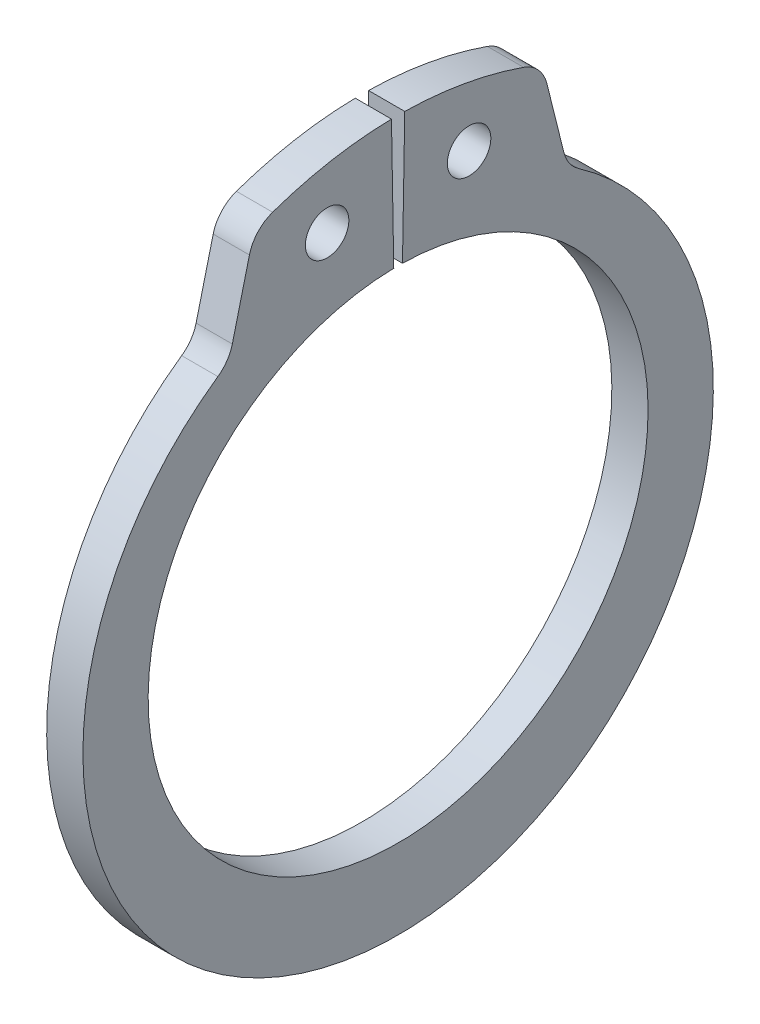
ISO-10303-21;
HEADER;
FILE_DESCRIPTION(('STEP AP214'),'2;1');
FILE_NAME('part.step','',(''),(''),'','','');
FILE_SCHEMA(('AUTOMOTIVE_DESIGN { 1 0 10303 214 1 1 1 1 }'));
ENDSEC;
DATA;
#1=APPLICATION_CONTEXT('core data for automotive mechanical design processes');
#2=APPLICATION_PROTOCOL_DEFINITION('international standard','automotive_design',2000,#1);
#3=PRODUCT_CONTEXT('',#1,'mechanical');
#4=PRODUCT('Part','Part','',(#3));
#5=PRODUCT_RELATED_PRODUCT_CATEGORY('part','',(#4));
#6=PRODUCT_DEFINITION_FORMATION('','',#4);
#7=PRODUCT_DEFINITION_CONTEXT('part definition',#1,'design');
#8=PRODUCT_DEFINITION('design','',#6,#7);
#9=PRODUCT_DEFINITION_SHAPE('','',#8);
#10=(LENGTH_UNIT() NAMED_UNIT(*) SI_UNIT(.MILLI.,.METRE.));
#11=(NAMED_UNIT(*) PLANE_ANGLE_UNIT() SI_UNIT($,.RADIAN.));
#12=(NAMED_UNIT(*) SI_UNIT($,.STERADIAN.) SOLID_ANGLE_UNIT());
#13=UNCERTAINTY_MEASURE_WITH_UNIT(LENGTH_MEASURE(1.E-05),#10,'distance_accuracy_value','');
#14=(GEOMETRIC_REPRESENTATION_CONTEXT(3) GLOBAL_UNCERTAINTY_ASSIGNED_CONTEXT((#13)) GLOBAL_UNIT_ASSIGNED_CONTEXT((#10,
#11,#12)) REPRESENTATION_CONTEXT('',''));
#15=CARTESIAN_POINT('',(0.,0.,0.));
#16=DIRECTION('',(0.,0.,1.));
#17=DIRECTION('',(1.,0.,0.));
#18=AXIS2_PLACEMENT_3D('',#15,#16,#17);
#19=CARTESIAN_POINT('',(0.5,8.96816184312502,3.13401869099666));
#20=DIRECTION('',(-1.,0.,0.));
#21=DIRECTION('',(0.,0.,1.));
#22=AXIS2_PLACEMENT_3D('',#19,#20,#21);
#23=CYLINDRICAL_SURFACE('',#22,0.999999999999999);
#24=CARTESIAN_POINT('',(-0.5,8.96816184312502,3.13401869099666));
#25=DIRECTION('',(-1.,0.,0.));
#26=DIRECTION('',(0.,0.,1.));
#27=AXIS2_PLACEMENT_3D('',#24,#25,#26);
#28=CIRCLE('',#27,0.999999999999999);
#29=CARTESIAN_POINT('',(-0.5,9.21008373872469,4.10431441727265));
#30=VERTEX_POINT('',#29);
#31=CARTESIAN_POINT('',(-0.5,9.91217887924345,3.46391539531209));
#32=VERTEX_POINT('',#31);
#33=EDGE_CURVE('E159',#30,#32,#28,.T.);
#34=ORIENTED_EDGE('',*,*,#33,.F.);
#35=DIRECTION('',(-1.,0.,0.));
#36=VECTOR('',#35,1.);
#37=CARTESIAN_POINT('',(0.5,9.21008373872469,4.10431441727265));
#38=LINE('',#37,#36);
#39=CARTESIAN_POINT('',(0.5,9.21008373872469,4.10431441727265));
#40=VERTEX_POINT('',#39);
#41=EDGE_CURVE('E11',#40,#30,#38,.T.);
#42=ORIENTED_EDGE('',*,*,#41,.F.);
#43=CARTESIAN_POINT('',(0.5,8.96816184312502,3.13401869099666));
#44=DIRECTION('',(-1.,0.,0.));
#45=DIRECTION('',(0.,0.,1.));
#46=AXIS2_PLACEMENT_3D('',#43,#44,#45);
#47=CIRCLE('',#46,0.999999999999999);
#48=CARTESIAN_POINT('',(0.5,9.91217887924345,3.46391539531209));
#49=VERTEX_POINT('',#48);
#50=EDGE_CURVE('E192',#40,#49,#47,.T.);
#51=ORIENTED_EDGE('',*,*,#50,.T.);
#52=DIRECTION('',(-1.,0.,0.));
#53=VECTOR('',#52,1.);
#54=CARTESIAN_POINT('',(0.5,9.91217887924345,3.46391539531209));
#55=LINE('',#54,#53);
#56=EDGE_CURVE('E41',#49,#32,#55,.T.);
#57=ORIENTED_EDGE('',*,*,#56,.T.);
#58=EDGE_LOOP('',(#34,#42,#51,#57));
#59=FACE_BOUND('',#58,.T.);
#60=ADVANCED_FACE('F38',(#59),#23,.T.);
#61=CARTESIAN_POINT('',(0.5,7.31761530924591,4.57615979123836));
#62=DIRECTION('',(0.,0.241921895599666,0.970295726275997));
#63=DIRECTION('',(0.,-0.970295726275997,0.241921895599666));
#64=AXIS2_PLACEMENT_3D('',#61,#62,#63);
#65=PLANE('',#64);
#66=DIRECTION('',(0.,0.970295726275997,-0.241921895599666));
#67=VECTOR('',#66,1.);
#68=CARTESIAN_POINT('',(-0.5,7.31761530924591,4.57615979123836));
#69=LINE('',#68,#67);
#70=CARTESIAN_POINT('',(-0.5,7.31761530924591,4.57615979123836));
#71=VERTEX_POINT('',#70);
#72=EDGE_CURVE('E190',#71,#30,#69,.T.);
#73=ORIENTED_EDGE('',*,*,#72,.F.);
#74=DIRECTION('',(-1.,0.,0.));
#75=VECTOR('',#74,1.);
#76=CARTESIAN_POINT('',(0.5,7.31761530924591,4.57615979123836));
#77=LINE('',#76,#75);
#78=CARTESIAN_POINT('',(0.5,7.31761530924591,4.57615979123836));
#79=VERTEX_POINT('',#78);
#80=EDGE_CURVE('E47',#79,#71,#77,.T.);
#81=ORIENTED_EDGE('',*,*,#80,.F.);
#82=DIRECTION('',(0.,0.970295726275997,-0.241921895599666));
#83=VECTOR('',#82,1.);
#84=CARTESIAN_POINT('',(0.5,7.31761530924591,4.57615979123836));
#85=LINE('',#84,#83);
#86=EDGE_CURVE('E149',#79,#40,#85,.T.);
#87=ORIENTED_EDGE('',*,*,#86,.T.);
#88=ORIENTED_EDGE('',*,*,#41,.T.);
#89=EDGE_LOOP('',(#73,#81,#87,#88));
#90=FACE_BOUND('',#89,.T.);
#91=ADVANCED_FACE('F212',(#90),#65,.T.);
#92=CARTESIAN_POINT('',(0.5,7.55953720484558,5.54645551751436));
#93=DIRECTION('',(-1.,0.,0.));
#94=DIRECTION('',(0.,0.,1.));
#95=AXIS2_PLACEMENT_3D('',#92,#93,#94);
#96=CYLINDRICAL_SURFACE('',#95,1.);
#97=CARTESIAN_POINT('',(-0.5,7.55953720484558,5.54645551751436));
#98=DIRECTION('',(1.,0.,0.));
#99=DIRECTION('',(0.,0.,-1.));
#100=AXIS2_PLACEMENT_3D('',#97,#98,#99);
#101=CIRCLE('',#100,1.);
#102=CARTESIAN_POINT('',(-0.5,6.73911195964233,4.97470170945253));
#103=VERTEX_POINT('',#102);
#104=EDGE_CURVE('E136',#103,#71,#101,.T.);
#105=ORIENTED_EDGE('',*,*,#104,.F.);
#106=DIRECTION('',(-1.,0.,0.));
#107=VECTOR('',#106,1.);
#108=CARTESIAN_POINT('',(0.5,6.73911195964233,4.97470170945253));
#109=LINE('',#108,#107);
#110=CARTESIAN_POINT('',(0.5,6.73911195964233,4.97470170945253));
#111=VERTEX_POINT('',#110);
#112=EDGE_CURVE('E131',#111,#103,#109,.T.);
#113=ORIENTED_EDGE('',*,*,#112,.F.);
#114=CARTESIAN_POINT('',(0.5,7.55953720484558,5.54645551751436));
#115=DIRECTION('',(1.,0.,0.));
#116=DIRECTION('',(0.,0.,-1.));
#117=AXIS2_PLACEMENT_3D('',#114,#115,#116);
#118=CIRCLE('',#117,1.);
#119=EDGE_CURVE('E134',#111,#79,#118,.T.);
#120=ORIENTED_EDGE('',*,*,#119,.T.);
#121=ORIENTED_EDGE('',*,*,#80,.T.);
#122=EDGE_LOOP('',(#105,#113,#120,#121));
#123=FACE_BOUND('',#122,.T.);
#124=ADVANCED_FACE('F133',(#123),#96,.F.);
#125=CARTESIAN_POINT('',(0.5,-0.399224177769538,0.));
#126=DIRECTION('',(-1.,0.,0.));
#127=DIRECTION('',(0.,0.,1.));
#128=AXIS2_PLACEMENT_3D('',#125,#126,#127);
#129=CYLINDRICAL_SURFACE('',#128,8.70077582223046);
#130=CARTESIAN_POINT('',(-0.5,-0.399224177769538,0.));
#131=DIRECTION('',(-1.,0.,0.));
#132=DIRECTION('',(0.,0.,1.));
#133=AXIS2_PLACEMENT_3D('',#130,#131,#132);
#134=CIRCLE('',#133,8.70077582223046);
#135=CARTESIAN_POINT('',(-0.5,6.73911195964233,-4.97470170945253));
#136=VERTEX_POINT('',#135);
#137=EDGE_CURVE('E187',#136,#103,#134,.T.);
#138=ORIENTED_EDGE('',*,*,#137,.F.);
#139=DIRECTION('',(-1.,0.,0.));
#140=VECTOR('',#139,1.);
#141=CARTESIAN_POINT('',(0.5,6.73911195964233,-4.97470170945253));
#142=LINE('',#141,#140);
#143=CARTESIAN_POINT('',(0.5,6.73911195964233,-4.97470170945253));
#144=VERTEX_POINT('',#143);
#145=EDGE_CURVE('E141',#144,#136,#142,.T.);
#146=ORIENTED_EDGE('',*,*,#145,.F.);
#147=CARTESIAN_POINT('',(0.5,-0.399224177769538,0.));
#148=DIRECTION('',(-1.,0.,0.));
#149=DIRECTION('',(0.,0.,1.));
#150=AXIS2_PLACEMENT_3D('',#147,#148,#149);
#151=CIRCLE('',#150,8.70077582223046);
#152=EDGE_CURVE('E147',#144,#111,#151,.T.);
#153=ORIENTED_EDGE('',*,*,#152,.T.);
#154=ORIENTED_EDGE('',*,*,#112,.T.);
#155=EDGE_LOOP('',(#138,#146,#153,#154));
#156=FACE_BOUND('',#155,.T.);
#157=ADVANCED_FACE('F151',(#156),#129,.T.);
#158=CARTESIAN_POINT('',(0.5,7.55953720484558,-5.54645551751436));
#159=DIRECTION('',(-1.,0.,0.));
#160=DIRECTION('',(0.,0.,1.));
#161=AXIS2_PLACEMENT_3D('',#158,#159,#160);
#162=CYLINDRICAL_SURFACE('',#161,1.);
#163=CARTESIAN_POINT('',(-0.5,7.55953720484558,-5.54645551751436));
#164=DIRECTION('',(1.,0.,0.));
#165=DIRECTION('',(0.,0.,-1.));
#166=AXIS2_PLACEMENT_3D('',#163,#164,#165);
#167=CIRCLE('',#166,1.);
#168=CARTESIAN_POINT('',(-0.5,7.31761530924591,-4.57615979123836));
#169=VERTEX_POINT('',#168);
#170=EDGE_CURVE('E184',#169,#136,#167,.T.);
#171=ORIENTED_EDGE('',*,*,#170,.F.);
#172=DIRECTION('',(-1.,0.,0.));
#173=VECTOR('',#172,1.);
#174=CARTESIAN_POINT('',(0.5,7.31761530924591,-4.57615979123836));
#175=LINE('',#174,#173);
#176=CARTESIAN_POINT('',(0.5,7.31761530924591,-4.57615979123836));
#177=VERTEX_POINT('',#176);
#178=EDGE_CURVE('E196',#177,#169,#175,.T.);
#179=ORIENTED_EDGE('',*,*,#178,.F.);
#180=CARTESIAN_POINT('',(0.5,7.55953720484558,-5.54645551751436));
#181=DIRECTION('',(1.,0.,0.));
#182=DIRECTION('',(0.,0.,-1.));
#183=AXIS2_PLACEMENT_3D('',#180,#181,#182);
#184=CIRCLE('',#183,1.);
#185=EDGE_CURVE('E152',#177,#144,#184,.T.);
#186=ORIENTED_EDGE('',*,*,#185,.T.);
#187=ORIENTED_EDGE('',*,*,#145,.T.);
#188=EDGE_LOOP('',(#171,#179,#186,#187));
#189=FACE_BOUND('',#188,.T.);
#190=ADVANCED_FACE('F225',(#189),#162,.F.);
#191=CARTESIAN_POINT('',(0.5,9.21008373872469,-4.10431441727265));
#192=DIRECTION('',(0.,0.241921895599665,-0.970295726275997));
#193=DIRECTION('',(0.,0.970295726275997,0.241921895599665));
#194=AXIS2_PLACEMENT_3D('',#191,#192,#193);
#195=PLANE('',#194);
#196=DIRECTION('',(0.,-0.970295726275997,-0.241921895599665));
#197=VECTOR('',#196,1.);
#198=CARTESIAN_POINT('',(-0.5,9.21008373872469,-4.10431441727265));
#199=LINE('',#198,#197);
#200=CARTESIAN_POINT('',(-0.5,9.21008373872469,-4.10431441727265));
#201=VERTEX_POINT('',#200);
#202=EDGE_CURVE('E181',#201,#169,#199,.T.);
#203=ORIENTED_EDGE('',*,*,#202,.F.);
#204=DIRECTION('',(-1.,0.,0.));
#205=VECTOR('',#204,1.);
#206=CARTESIAN_POINT('',(0.5,9.21008373872469,-4.10431441727265));
#207=LINE('',#206,#205);
#208=CARTESIAN_POINT('',(0.5,9.21008373872469,-4.10431441727265));
#209=VERTEX_POINT('',#208);
#210=EDGE_CURVE('E198',#209,#201,#207,.T.);
#211=ORIENTED_EDGE('',*,*,#210,.F.);
#212=DIRECTION('',(0.,-0.970295726275997,-0.241921895599665));
#213=VECTOR('',#212,1.);
#214=CARTESIAN_POINT('',(0.5,9.21008373872469,-4.10431441727265));
#215=LINE('',#214,#213);
#216=EDGE_CURVE('E154',#209,#177,#215,.T.);
#217=ORIENTED_EDGE('',*,*,#216,.T.);
#218=ORIENTED_EDGE('',*,*,#178,.T.);
#219=EDGE_LOOP('',(#203,#211,#217,#218));
#220=FACE_BOUND('',#219,.T.);
#221=ADVANCED_FACE('F228',(#220),#195,.T.);
#222=CARTESIAN_POINT('',(0.5,8.96816184312502,-3.13401869099665));
#223=DIRECTION('',(-1.,0.,0.));
#224=DIRECTION('',(0.,0.,1.));
#225=AXIS2_PLACEMENT_3D('',#222,#223,#224);
#226=CYLINDRICAL_SURFACE('',#225,1.);
#227=CARTESIAN_POINT('',(-0.5,8.96816184312502,-3.13401869099665));
#228=DIRECTION('',(-1.,0.,0.));
#229=DIRECTION('',(0.,0.,1.));
#230=AXIS2_PLACEMENT_3D('',#227,#228,#229);
#231=CIRCLE('',#230,1.);
#232=CARTESIAN_POINT('',(-0.5,9.91217887924345,-3.46391539531209));
#233=VERTEX_POINT('',#232);
#234=EDGE_CURVE('E178',#233,#201,#231,.T.);
#235=ORIENTED_EDGE('',*,*,#234,.F.);
#236=DIRECTION('',(-1.,0.,0.));
#237=VECTOR('',#236,1.);
#238=CARTESIAN_POINT('',(0.5,9.91217887924345,-3.46391539531209));
#239=LINE('',#238,#237);
#240=CARTESIAN_POINT('',(0.5,9.91217887924345,-3.46391539531209));
#241=VERTEX_POINT('',#240);
#242=EDGE_CURVE('E200',#241,#233,#239,.T.);
#243=ORIENTED_EDGE('',*,*,#242,.F.);
#244=CARTESIAN_POINT('',(0.5,8.96816184312502,-3.13401869099665));
#245=DIRECTION('',(-1.,0.,0.));
#246=DIRECTION('',(0.,0.,1.));
#247=AXIS2_PLACEMENT_3D('',#244,#245,#246);
#248=CIRCLE('',#247,1.);
#249=EDGE_CURVE('E302',#241,#209,#248,.T.);
#250=ORIENTED_EDGE('',*,*,#249,.T.);
#251=ORIENTED_EDGE('',*,*,#210,.T.);
#252=EDGE_LOOP('',(#235,#243,#250,#251));
#253=FACE_BOUND('',#252,.T.);
#254=ADVANCED_FACE('F232',(#253),#226,.T.);
#255=CARTESIAN_POINT('',(0.5,0.,0.));
#256=DIRECTION('',(-1.,0.,0.));
#257=DIRECTION('',(0.,0.,1.));
#258=AXIS2_PLACEMENT_3D('',#255,#256,#257);
#259=CYLINDRICAL_SURFACE('',#258,10.5);
#260=CARTESIAN_POINT('',(-0.5,0.,0.));
#261=DIRECTION('',(-1.,0.,0.));
#262=DIRECTION('',(0.,0.,1.));
#263=AXIS2_PLACEMENT_3D('',#260,#261,#262);
#264=CIRCLE('',#263,10.5);
#265=CARTESIAN_POINT('',(-0.5,10.4984007991421,-0.183250267591479));
#266=VERTEX_POINT('',#265);
#267=EDGE_CURVE('E175',#266,#233,#264,.T.);
#268=ORIENTED_EDGE('',*,*,#267,.F.);
#269=DIRECTION('',(-1.,0.,0.));
#270=VECTOR('',#269,1.);
#271=CARTESIAN_POINT('',(0.5,10.4984007991421,-0.183250267591479));
#272=LINE('',#271,#270);
#273=CARTESIAN_POINT('',(0.5,10.4984007991421,-0.183250267591479));
#274=VERTEX_POINT('',#273);
#275=EDGE_CURVE('E202',#274,#266,#272,.T.);
#276=ORIENTED_EDGE('',*,*,#275,.F.);
#277=CARTESIAN_POINT('',(0.5,0.,0.));
#278=DIRECTION('',(-1.,0.,0.));
#279=DIRECTION('',(0.,0.,1.));
#280=AXIS2_PLACEMENT_3D('',#277,#278,#279);
#281=CIRCLE('',#280,10.5);
#282=EDGE_CURVE('E299',#274,#241,#281,.T.);
#283=ORIENTED_EDGE('',*,*,#282,.T.);
#284=ORIENTED_EDGE('',*,*,#242,.T.);
#285=EDGE_LOOP('',(#268,#276,#283,#284));
#286=FACE_BOUND('',#285,.T.);
#287=ADVANCED_FACE('F236',(#286),#259,.T.);
#288=CARTESIAN_POINT('',(0.5,6.8989490965791,-0.120421604417256));
#289=DIRECTION('',(0.,0.0174524064372841,0.999847695156391));
#290=DIRECTION('',(0.,-0.999847695156391,0.0174524064372841));
#291=AXIS2_PLACEMENT_3D('',#288,#289,#290);
#292=PLANE('',#291);
#293=DIRECTION('',(0.,0.999847695156391,-0.0174524064372841));
#294=VECTOR('',#293,1.);
#295=CARTESIAN_POINT('',(-0.5,6.8989490965791,-0.120421604417256));
#296=LINE('',#295,#294);
#297=CARTESIAN_POINT('',(-0.5,6.8989490965791,-0.120421604417256));
#298=VERTEX_POINT('',#297);
#299=EDGE_CURVE('E172',#298,#266,#296,.T.);
#300=ORIENTED_EDGE('',*,*,#299,.F.);
#301=DIRECTION('',(-1.,0.,0.));
#302=VECTOR('',#301,1.);
#303=CARTESIAN_POINT('',(0.5,6.8989490965791,-0.120421604417256));
#304=LINE('',#303,#302);
#305=CARTESIAN_POINT('',(0.5,6.8989490965791,-0.120421604417256));
#306=VERTEX_POINT('',#305);
#307=EDGE_CURVE('E204',#306,#298,#304,.T.);
#308=ORIENTED_EDGE('',*,*,#307,.F.);
#309=DIRECTION('',(0.,0.999847695156391,-0.0174524064372841));
#310=VECTOR('',#309,1.);
#311=CARTESIAN_POINT('',(0.5,6.8989490965791,-0.120421604417256));
#312=LINE('',#311,#310);
#313=EDGE_CURVE('E296',#306,#274,#312,.T.);
#314=ORIENTED_EDGE('',*,*,#313,.T.);
#315=ORIENTED_EDGE('',*,*,#275,.T.);
#316=EDGE_LOOP('',(#300,#308,#314,#315));
#317=FACE_BOUND('',#316,.T.);
#318=ADVANCED_FACE('F240',(#317),#292,.T.);
#319=CARTESIAN_POINT('',(0.5,0.,0.));
#320=DIRECTION('',(-1.,0.,0.));
#321=DIRECTION('',(0.,0.,1.));
#322=AXIS2_PLACEMENT_3D('',#319,#320,#321);
#323=CYLINDRICAL_SURFACE('',#322,6.90000000000002);
#324=CARTESIAN_POINT('',(-0.5,0.,0.));
#325=DIRECTION('',(1.,0.,0.));
#326=DIRECTION('',(0.,0.,-1.));
#327=AXIS2_PLACEMENT_3D('',#324,#325,#326);
#328=CIRCLE('',#327,6.90000000000002);
#329=CARTESIAN_POINT('',(-0.5,6.8989490965791,0.120421604417256));
#330=VERTEX_POINT('',#329);
#331=EDGE_CURVE('E169',#330,#298,#328,.T.);
#332=ORIENTED_EDGE('',*,*,#331,.F.);
#333=DIRECTION('',(-1.,0.,0.));
#334=VECTOR('',#333,1.);
#335=CARTESIAN_POINT('',(0.5,6.8989490965791,0.120421604417256));
#336=LINE('',#335,#334);
#337=CARTESIAN_POINT('',(0.5,6.8989490965791,0.120421604417256));
#338=VERTEX_POINT('',#337);
#339=EDGE_CURVE('E206',#338,#330,#336,.T.);
#340=ORIENTED_EDGE('',*,*,#339,.F.);
#341=CARTESIAN_POINT('',(0.5,0.,0.));
#342=DIRECTION('',(1.,0.,0.));
#343=DIRECTION('',(0.,0.,-1.));
#344=AXIS2_PLACEMENT_3D('',#341,#342,#343);
#345=CIRCLE('',#344,6.90000000000002);
#346=EDGE_CURVE('E293',#338,#306,#345,.T.);
#347=ORIENTED_EDGE('',*,*,#346,.T.);
#348=ORIENTED_EDGE('',*,*,#307,.T.);
#349=EDGE_LOOP('',(#332,#340,#347,#348));
#350=FACE_BOUND('',#349,.T.);
#351=ADVANCED_FACE('F244',(#350),#323,.F.);
#352=CARTESIAN_POINT('',(0.5,10.4984007991421,0.183250267591477));
#353=DIRECTION('',(0.,0.0174524064372835,-0.999847695156391));
#354=DIRECTION('',(0.,0.999847695156391,0.0174524064372835));
#355=AXIS2_PLACEMENT_3D('',#352,#353,#354);
#356=PLANE('',#355);
#357=DIRECTION('',(0.,-0.999847695156391,-0.0174524064372835));
#358=VECTOR('',#357,1.);
#359=CARTESIAN_POINT('',(-0.5,10.4984007991421,0.183250267591477));
#360=LINE('',#359,#358);
#361=CARTESIAN_POINT('',(-0.5,10.4984007991421,0.183250267591477));
#362=VERTEX_POINT('',#361);
#363=EDGE_CURVE('E166',#362,#330,#360,.T.);
#364=ORIENTED_EDGE('',*,*,#363,.F.);
#365=DIRECTION('',(-1.,0.,0.));
#366=VECTOR('',#365,1.);
#367=CARTESIAN_POINT('',(0.5,10.4984007991421,0.183250267591477));
#368=LINE('',#367,#366);
#369=CARTESIAN_POINT('',(0.5,10.4984007991421,0.183250267591477));
#370=VERTEX_POINT('',#369);
#371=EDGE_CURVE('E207',#370,#362,#368,.T.);
#372=ORIENTED_EDGE('',*,*,#371,.F.);
#373=DIRECTION('',(0.,-0.999847695156391,-0.0174524064372835));
#374=VECTOR('',#373,1.);
#375=CARTESIAN_POINT('',(0.5,10.4984007991421,0.183250267591477));
#376=LINE('',#375,#374);
#377=EDGE_CURVE('E290',#370,#338,#376,.T.);
#378=ORIENTED_EDGE('',*,*,#377,.T.);
#379=ORIENTED_EDGE('',*,*,#339,.T.);
#380=EDGE_LOOP('',(#364,#372,#378,#379));
#381=FACE_BOUND('',#380,.T.);
#382=ADVANCED_FACE('F248',(#381),#356,.T.);
#383=CARTESIAN_POINT('',(0.5,0.,0.));
#384=DIRECTION('',(-1.,0.,0.));
#385=DIRECTION('',(0.,0.,1.));
#386=AXIS2_PLACEMENT_3D('',#383,#384,#385);
#387=CYLINDRICAL_SURFACE('',#386,10.5);
#388=CARTESIAN_POINT('',(-0.5,0.,0.));
#389=DIRECTION('',(-1.,0.,0.));
#390=DIRECTION('',(0.,0.,1.));
#391=AXIS2_PLACEMENT_3D('',#388,#389,#390);
#392=CIRCLE('',#391,10.5);
#393=EDGE_CURVE('E162',#32,#362,#392,.T.);
#394=ORIENTED_EDGE('',*,*,#393,.F.);
#395=ORIENTED_EDGE('',*,*,#56,.F.);
#396=CARTESIAN_POINT('',(0.5,0.,0.));
#397=DIRECTION('',(-1.,0.,0.));
#398=DIRECTION('',(0.,0.,1.));
#399=AXIS2_PLACEMENT_3D('',#396,#397,#398);
#400=CIRCLE('',#399,10.5);
#401=EDGE_CURVE('E288',#49,#370,#400,.T.);
#402=ORIENTED_EDGE('',*,*,#401,.T.);
#403=ORIENTED_EDGE('',*,*,#371,.T.);
#404=EDGE_LOOP('',(#394,#395,#402,#403));
#405=FACE_BOUND('',#404,.T.);
#406=ADVANCED_FACE('F209',(#405),#387,.T.);
#407=CARTESIAN_POINT('',(0.5,8.96816184312502,3.13401869099666));
#408=DIRECTION('',(-1.,0.,0.));
#409=DIRECTION('',(0.,0.,1.));
#410=AXIS2_PLACEMENT_3D('',#407,#408,#409);
#411=PLANE('',#410);
#412=CARTESIAN_POINT('',(0.5,8.66711980549086,1.9596288316201));
#413=DIRECTION('',(-1.,0.,0.));
#414=DIRECTION('',(0.,0.,-1.));
#415=AXIS2_PLACEMENT_3D('',#412,#413,#414);
#416=CIRCLE('',#415,0.6);
#417=CARTESIAN_POINT('',(0.5,8.66711980549086,1.3596288316201));
#418=VERTEX_POINT('',#417);
#419=EDGE_CURVE('E275',#418,#418,#416,.T.);
#420=ORIENTED_EDGE('',*,*,#419,.T.);
#421=EDGE_LOOP('',(#420));
#422=FACE_BOUND('',#421,.T.);
#423=CARTESIAN_POINT('',(0.5,8.66711980549086,-1.9596288316201));
#424=DIRECTION('',(-1.,0.,0.));
#425=DIRECTION('',(0.,0.,-1.));
#426=AXIS2_PLACEMENT_3D('',#423,#424,#425);
#427=CIRCLE('',#426,0.6);
#428=CARTESIAN_POINT('',(0.5,8.66711980549086,-2.5596288316201));
#429=VERTEX_POINT('',#428);
#430=EDGE_CURVE('E163',#429,#429,#427,.T.);
#431=ORIENTED_EDGE('',*,*,#430,.T.);
#432=EDGE_LOOP('',(#431));
#433=FACE_BOUND('',#432,.T.);
#434=ORIENTED_EDGE('',*,*,#50,.F.);
#435=ORIENTED_EDGE('',*,*,#86,.F.);
#436=ORIENTED_EDGE('',*,*,#119,.F.);
#437=ORIENTED_EDGE('',*,*,#152,.F.);
#438=ORIENTED_EDGE('',*,*,#185,.F.);
#439=ORIENTED_EDGE('',*,*,#216,.F.);
#440=ORIENTED_EDGE('',*,*,#249,.F.);
#441=ORIENTED_EDGE('',*,*,#282,.F.);
#442=ORIENTED_EDGE('',*,*,#313,.F.);
#443=ORIENTED_EDGE('',*,*,#346,.F.);
#444=ORIENTED_EDGE('',*,*,#377,.F.);
#445=ORIENTED_EDGE('',*,*,#401,.F.);
#446=EDGE_LOOP('',(#434,#435,#436,#437,#438,#439,#440,#441,#442,#443,#444,#445));
#447=FACE_BOUND('',#446,.T.);
#448=ADVANCED_FACE('F145',(#422,#433,#447),#411,.F.);
#449=CARTESIAN_POINT('',(-0.5,8.96816184312502,3.13401869099666));
#450=DIRECTION('',(-1.,0.,0.));
#451=DIRECTION('',(0.,0.,1.));
#452=AXIS2_PLACEMENT_3D('',#449,#450,#451);
#453=PLANE('',#452);
#454=CARTESIAN_POINT('',(-0.5,8.66711980549086,1.9596288316201));
#455=DIRECTION('',(-1.,0.,0.));
#456=DIRECTION('',(0.,0.,-1.));
#457=AXIS2_PLACEMENT_3D('',#454,#455,#456);
#458=CIRCLE('',#457,0.6);
#459=CARTESIAN_POINT('',(-0.5,8.66711980549086,1.3596288316201));
#460=VERTEX_POINT('',#459);
#461=EDGE_CURVE('E278',#460,#460,#458,.T.);
#462=ORIENTED_EDGE('',*,*,#461,.F.);
#463=EDGE_LOOP('',(#462));
#464=FACE_BOUND('',#463,.T.);
#465=CARTESIAN_POINT('',(-0.5,8.66711980549086,-1.9596288316201));
#466=DIRECTION('',(-1.,0.,0.));
#467=DIRECTION('',(0.,0.,-1.));
#468=AXIS2_PLACEMENT_3D('',#465,#466,#467);
#469=CIRCLE('',#468,0.6);
#470=CARTESIAN_POINT('',(-0.5,8.66711980549086,-2.5596288316201));
#471=VERTEX_POINT('',#470);
#472=EDGE_CURVE('E280',#471,#471,#469,.T.);
#473=ORIENTED_EDGE('',*,*,#472,.F.);
#474=EDGE_LOOP('',(#473));
#475=FACE_BOUND('',#474,.T.);
#476=ORIENTED_EDGE('',*,*,#33,.T.);
#477=ORIENTED_EDGE('',*,*,#393,.T.);
#478=ORIENTED_EDGE('',*,*,#363,.T.);
#479=ORIENTED_EDGE('',*,*,#331,.T.);
#480=ORIENTED_EDGE('',*,*,#299,.T.);
#481=ORIENTED_EDGE('',*,*,#267,.T.);
#482=ORIENTED_EDGE('',*,*,#234,.T.);
#483=ORIENTED_EDGE('',*,*,#202,.T.);
#484=ORIENTED_EDGE('',*,*,#170,.T.);
#485=ORIENTED_EDGE('',*,*,#137,.T.);
#486=ORIENTED_EDGE('',*,*,#104,.T.);
#487=ORIENTED_EDGE('',*,*,#72,.T.);
#488=EDGE_LOOP('',(#476,#477,#478,#479,#480,#481,#482,#483,#484,#485,#486,#487));
#489=FACE_BOUND('',#488,.T.);
#490=ADVANCED_FACE('F211',(#464,#475,#489),#453,.T.);
#491=CARTESIAN_POINT('',(0.5,8.66711980549086,-1.9596288316201));
#492=DIRECTION('',(-1.,0.,0.));
#493=DIRECTION('',(0.,0.,1.));
#494=AXIS2_PLACEMENT_3D('',#491,#492,#493);
#495=CYLINDRICAL_SURFACE('',#494,0.6);
#496=ORIENTED_EDGE('',*,*,#430,.F.);
#497=EDGE_LOOP('',(#496));
#498=FACE_BOUND('',#497,.T.);
#499=ORIENTED_EDGE('',*,*,#472,.T.);
#500=EDGE_LOOP('',(#499));
#501=FACE_BOUND('',#500,.T.);
#502=ADVANCED_FACE('F260',(#498,#501),#495,.F.);
#503=CARTESIAN_POINT('',(0.5,8.66711980549086,1.9596288316201));
#504=DIRECTION('',(-1.,0.,0.));
#505=DIRECTION('',(0.,0.,1.));
#506=AXIS2_PLACEMENT_3D('',#503,#504,#505);
#507=CYLINDRICAL_SURFACE('',#506,0.6);
#508=ORIENTED_EDGE('',*,*,#419,.F.);
#509=EDGE_LOOP('',(#508));
#510=FACE_BOUND('',#509,.T.);
#511=ORIENTED_EDGE('',*,*,#461,.T.);
#512=EDGE_LOOP('',(#511));
#513=FACE_BOUND('',#512,.T.);
#514=ADVANCED_FACE('F267',(#510,#513),#507,.F.);
#515=CLOSED_SHELL('',(#60,#91,#124,#157,#190,#221,#254,#287,#318,#351,#382,#406,#448,#490,#502,#514));
#516=MANIFOLD_SOLID_BREP('B2',#515);
#517=ADVANCED_BREP_SHAPE_REPRESENTATION('',(#18,#516),#14);
#518=SHAPE_DEFINITION_REPRESENTATION(#9,#517);
ENDSEC;
END-ISO-10303-21;
